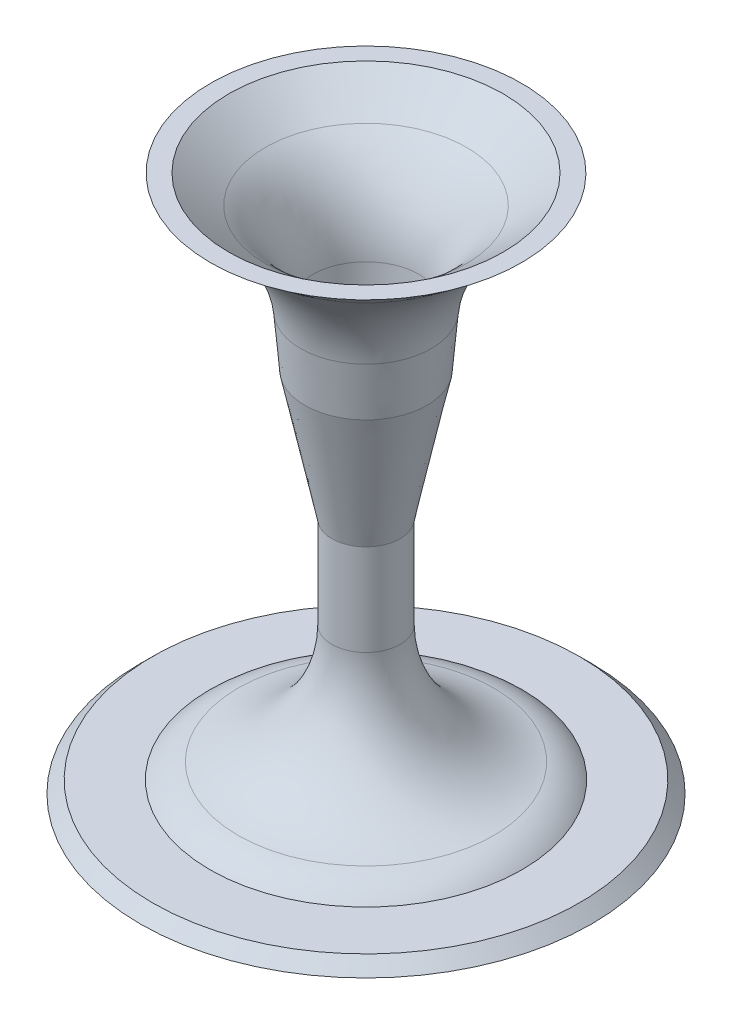
ISO-10303-21;
HEADER;
FILE_DESCRIPTION(('STEP AP214'),'2;1');
FILE_NAME('part.step','',(''),(''),'','','');
FILE_SCHEMA(('AUTOMOTIVE_DESIGN { 1 0 10303 214 1 1 1 1 }'));
ENDSEC;
DATA;
#1=APPLICATION_CONTEXT('core data for automotive mechanical design processes');
#2=APPLICATION_PROTOCOL_DEFINITION('international standard','automotive_design',2000,#1);
#3=PRODUCT_CONTEXT('',#1,'mechanical');
#4=PRODUCT('Part','Part','',(#3));
#5=PRODUCT_RELATED_PRODUCT_CATEGORY('part','',(#4));
#6=PRODUCT_DEFINITION_FORMATION('','',#4);
#7=PRODUCT_DEFINITION_CONTEXT('part definition',#1,'design');
#8=PRODUCT_DEFINITION('design','',#6,#7);
#9=PRODUCT_DEFINITION_SHAPE('','',#8);
#10=(LENGTH_UNIT() NAMED_UNIT(*) SI_UNIT(.MILLI.,.METRE.));
#11=(NAMED_UNIT(*) PLANE_ANGLE_UNIT() SI_UNIT($,.RADIAN.));
#12=(NAMED_UNIT(*) SI_UNIT($,.STERADIAN.) SOLID_ANGLE_UNIT());
#13=UNCERTAINTY_MEASURE_WITH_UNIT(LENGTH_MEASURE(1.E-05),#10,'distance_accuracy_value','');
#14=(GEOMETRIC_REPRESENTATION_CONTEXT(3) GLOBAL_UNCERTAINTY_ASSIGNED_CONTEXT((#13)) GLOBAL_UNIT_ASSIGNED_CONTEXT((#10,
#11,#12)) REPRESENTATION_CONTEXT('',''));
#15=CARTESIAN_POINT('',(0.,0.,0.));
#16=DIRECTION('',(0.,0.,1.));
#17=DIRECTION('',(1.,0.,0.));
#18=AXIS2_PLACEMENT_3D('',#15,#16,#17);
#19=CARTESIAN_POINT('',(-25.5899999999998,-58.1499999999998,0.));
#20=DIRECTION('',(0.,1.,0.));
#21=DIRECTION('',(0.,0.,1.));
#22=AXIS2_PLACEMENT_3D('',#19,#20,#21);
#23=PLANE('',#22);
#24=CARTESIAN_POINT('',(0.,-58.1499999999998,0.));
#25=DIRECTION('',(0.,1.,0.));
#26=DIRECTION('',(0.,0.,1.));
#27=AXIS2_PLACEMENT_3D('',#24,#25,#26);
#28=CIRCLE('',#27,35.);
#29=CARTESIAN_POINT('',(0.,-58.1499999999998,35.));
#30=VERTEX_POINT('',#29);
#31=EDGE_CURVE('E53',#30,#30,#28,.T.);
#32=ORIENTED_EDGE('',*,*,#31,.T.);
#33=EDGE_LOOP('',(#32));
#34=FACE_BOUND('',#33,.T.);
#35=CARTESIAN_POINT('',(0.,-58.1499999999998,0.));
#36=DIRECTION('',(0.,1.,0.));
#37=DIRECTION('',(0.,0.,1.));
#38=AXIS2_PLACEMENT_3D('',#35,#36,#37);
#39=CIRCLE('',#38,25.5899999999998);
#40=CARTESIAN_POINT('',(0.,-58.1499999999998,25.5899999999998));
#41=VERTEX_POINT('',#40);
#42=EDGE_CURVE('E85',#41,#41,#39,.T.);
#43=ORIENTED_EDGE('',*,*,#42,.F.);
#44=EDGE_LOOP('',(#43));
#45=FACE_BOUND('',#44,.T.);
#46=ADVANCED_FACE('F44',(#34,#45),#23,.T.);
#47=CARTESIAN_POINT('',(0.,-58.1499999999998,0.));
#48=DIRECTION('',(0.,-1.,0.));
#49=DIRECTION('',(0.,0.,-1.));
#50=AXIS2_PLACEMENT_3D('',#47,#48,#49);
#51=CONICAL_SURFACE('',#50,35.,0.78539816339745);
#52=CARTESIAN_POINT('',(0.,-60.1499999999998,0.));
#53=DIRECTION('',(0.,1.,0.));
#54=DIRECTION('',(0.,0.,1.));
#55=AXIS2_PLACEMENT_3D('',#52,#53,#54);
#56=CIRCLE('',#55,37.);
#57=CARTESIAN_POINT('',(0.,-60.1499999999998,37.));
#58=VERTEX_POINT('',#57);
#59=EDGE_CURVE('E143',#58,#58,#56,.T.);
#60=ORIENTED_EDGE('',*,*,#59,.T.);
#61=EDGE_LOOP('',(#60));
#62=FACE_BOUND('',#61,.T.);
#63=ORIENTED_EDGE('',*,*,#31,.F.);
#64=EDGE_LOOP('',(#63));
#65=FACE_BOUND('',#64,.T.);
#66=ADVANCED_FACE('F69',(#62,#65),#51,.T.);
#67=CARTESIAN_POINT('',(-37.,-60.1499999999998,0.));
#68=DIRECTION('',(0.,-1.,0.));
#69=DIRECTION('',(0.,0.,-1.));
#70=AXIS2_PLACEMENT_3D('',#67,#68,#69);
#71=PLANE('',#70);
#72=ORIENTED_EDGE('',*,*,#59,.F.);
#73=EDGE_LOOP('',(#72));
#74=FACE_BOUND('',#73,.T.);
#75=ADVANCED_FACE('F59',(#74),#71,.T.);
#76=CARTESIAN_POINT('',(0.,-58.1499999999998,0.));
#77=DIRECTION('',(0.,1.,0.));
#78=DIRECTION('',(0.,0.,1.));
#79=AXIS2_PLACEMENT_3D('',#76,#77,#78);
#80=CONICAL_SURFACE('',#79,0.,0.1617561098565);
#81=CARTESIAN_POINT('',(0.,-36.15,0.));
#82=DIRECTION('',(0.,1.,0.));
#83=DIRECTION('',(0.,0.,1.));
#84=AXIS2_PLACEMENT_3D('',#81,#82,#83);
#85=CIRCLE('',#84,3.58999999999998);
#86=CARTESIAN_POINT('',(0.,-36.15,3.58999999999998));
#87=VERTEX_POINT('',#86);
#88=EDGE_CURVE('E140',#87,#87,#85,.T.);
#89=ORIENTED_EDGE('',*,*,#88,.T.);
#90=EDGE_LOOP('',(#89));
#91=FACE_BOUND('',#90,.T.);
#92=CARTESIAN_POINT('',(0.,-58.1499999999998,0.));
#93=VERTEX_POINT('',#92);
#94=VERTEX_LOOP('',#93);
#95=FACE_BOUND('',#94,.T.);
#96=ADVANCED_FACE('F56',(#91,#95),#80,.F.);
#97=CARTESIAN_POINT('',(0.,74.3904688799529,0.));
#98=DIRECTION('',(0.,1.,0.));
#99=DIRECTION('',(0.,0.,1.));
#100=AXIS2_PLACEMENT_3D('',#97,#98,#99);
#101=CYLINDRICAL_SURFACE('',#100,3.58999999999998);
#102=CARTESIAN_POINT('',(0.,-21.15,0.));
#103=DIRECTION('',(0.,1.,0.));
#104=DIRECTION('',(0.,0.,1.));
#105=AXIS2_PLACEMENT_3D('',#102,#103,#104);
#106=CIRCLE('',#105,3.58999999999999);
#107=CARTESIAN_POINT('',(0.,-21.15,3.58999999999999));
#108=VERTEX_POINT('',#107);
#109=EDGE_CURVE('E136',#108,#108,#106,.T.);
#110=ORIENTED_EDGE('',*,*,#109,.T.);
#111=EDGE_LOOP('',(#110));
#112=FACE_BOUND('',#111,.T.);
#113=ORIENTED_EDGE('',*,*,#88,.F.);
#114=EDGE_LOOP('',(#113));
#115=FACE_BOUND('',#114,.T.);
#116=ADVANCED_FACE('F58',(#112,#115),#101,.F.);
#117=CARTESIAN_POINT('',(0.,-21.15,0.));
#118=DIRECTION('',(0.,1.,0.));
#119=DIRECTION('',(0.,0.,1.));
#120=AXIS2_PLACEMENT_3D('',#117,#118,#119);
#121=CONICAL_SURFACE('',#120,3.58999999999999,0.205565312722542);
#122=CARTESIAN_POINT('',(0.,0.,0.));
#123=DIRECTION('',(0.,1.,0.));
#124=DIRECTION('',(0.,0.,1.));
#125=AXIS2_PLACEMENT_3D('',#122,#123,#124);
#126=CIRCLE('',#125,8.);
#127=CARTESIAN_POINT('',(0.,0.,8.));
#128=VERTEX_POINT('',#127);
#129=EDGE_CURVE('E132',#128,#128,#126,.T.);
#130=ORIENTED_EDGE('',*,*,#129,.T.);
#131=EDGE_LOOP('',(#130));
#132=FACE_BOUND('',#131,.T.);
#133=ORIENTED_EDGE('',*,*,#109,.F.);
#134=EDGE_LOOP('',(#133));
#135=FACE_BOUND('',#134,.T.);
#136=ADVANCED_FACE('F66',(#132,#135),#121,.F.);
#137=CARTESIAN_POINT('',(0.,0.,0.));
#138=DIRECTION('',(0.,1.,0.));
#139=DIRECTION('',(0.,0.,1.));
#140=AXIS2_PLACEMENT_3D('',#137,#138,#139);
#141=CONICAL_SURFACE('',#140,8.,0.0831412318884395);
#142=CARTESIAN_POINT('',(0.,9.19533592387511,0.));
#143=DIRECTION('',(0.,1.,0.));
#144=DIRECTION('',(0.,0.,1.));
#145=AXIS2_PLACEMENT_3D('',#142,#143,#144);
#146=CIRCLE('',#145,8.76627799365624);
#147=CARTESIAN_POINT('',(0.,9.19533592387511,8.76627799365624));
#148=VERTEX_POINT('',#147);
#149=EDGE_CURVE('E128',#148,#148,#146,.T.);
#150=ORIENTED_EDGE('',*,*,#149,.T.);
#151=EDGE_LOOP('',(#150));
#152=FACE_BOUND('',#151,.T.);
#153=ORIENTED_EDGE('',*,*,#129,.F.);
#154=EDGE_LOOP('',(#153));
#155=FACE_BOUND('',#154,.T.);
#156=ADVANCED_FACE('F154',(#152,#155),#141,.F.);
#157=CARTESIAN_POINT('',(0.,7.53442632680031,0.));
#158=DIRECTION('',(0.,1.,0.));
#159=DIRECTION('',(0.,0.,1.));
#160=AXIS2_PLACEMENT_3D('',#157,#158,#159);
#161=TOROIDAL_SURFACE('',#160,28.6971931585538,20.);
#162=CARTESIAN_POINT('',(0.,23.3869061088923,0.));
#163=DIRECTION('',(0.,1.,0.));
#164=DIRECTION('',(0.,0.,1.));
#165=AXIS2_PLACEMENT_3D('',#162,#163,#164);
#166=CIRCLE('',#165,16.50297794156);
#167=CARTESIAN_POINT('',(0.,23.3869061088923,16.50297794156));
#168=VERTEX_POINT('',#167);
#169=EDGE_CURVE('E124',#168,#168,#166,.T.);
#170=ORIENTED_EDGE('',*,*,#169,.T.);
#171=EDGE_LOOP('',(#170));
#172=FACE_BOUND('',#171,.T.);
#173=ORIENTED_EDGE('',*,*,#149,.F.);
#174=EDGE_LOOP('',(#173));
#175=FACE_BOUND('',#174,.T.);
#176=ADVANCED_FACE('F160',(#172,#175),#161,.T.);
#177=CARTESIAN_POINT('',(0.,23.3869061088923,0.));
#178=DIRECTION('',(0.,1.,0.));
#179=DIRECTION('',(0.,0.,1.));
#180=AXIS2_PLACEMENT_3D('',#177,#178,#179);
#181=CONICAL_SURFACE('',#180,16.50297794156,0.915100700553362);
#182=CARTESIAN_POINT('',(0.,28.,0.));
#183=DIRECTION('',(0.,1.,0.));
#184=DIRECTION('',(0.,0.,1.));
#185=AXIS2_PLACEMENT_3D('',#182,#183,#184);
#186=CIRCLE('',#185,22.5);
#187=CARTESIAN_POINT('',(0.,28.,22.5));
#188=VERTEX_POINT('',#187);
#189=EDGE_CURVE('E120',#188,#188,#186,.T.);
#190=ORIENTED_EDGE('',*,*,#189,.T.);
#191=EDGE_LOOP('',(#190));
#192=FACE_BOUND('',#191,.T.);
#193=ORIENTED_EDGE('',*,*,#169,.F.);
#194=EDGE_LOOP('',(#193));
#195=FACE_BOUND('',#194,.T.);
#196=ADVANCED_FACE('F166',(#192,#195),#181,.F.);
#197=CARTESIAN_POINT('',(-25.5,28.,0.));
#198=DIRECTION('',(0.,1.,0.));
#199=DIRECTION('',(0.,0.,1.));
#200=AXIS2_PLACEMENT_3D('',#197,#198,#199);
#201=PLANE('',#200);
#202=CARTESIAN_POINT('',(0.,28.,0.));
#203=DIRECTION('',(0.,1.,0.));
#204=DIRECTION('',(0.,0.,1.));
#205=AXIS2_PLACEMENT_3D('',#202,#203,#204);
#206=CIRCLE('',#205,25.5);
#207=CARTESIAN_POINT('',(0.,28.,25.5));
#208=VERTEX_POINT('',#207);
#209=EDGE_CURVE('E116',#208,#208,#206,.T.);
#210=ORIENTED_EDGE('',*,*,#209,.T.);
#211=EDGE_LOOP('',(#210));
#212=FACE_BOUND('',#211,.T.);
#213=ORIENTED_EDGE('',*,*,#189,.F.);
#214=EDGE_LOOP('',(#213));
#215=FACE_BOUND('',#214,.T.);
#216=ADVANCED_FACE('F170',(#212,#215),#201,.T.);
#217=CARTESIAN_POINT('',(0.,28.,0.));
#218=DIRECTION('',(0.,1.,0.));
#219=DIRECTION('',(0.,0.,1.));
#220=AXIS2_PLACEMENT_3D('',#217,#218,#219);
#221=CONICAL_SURFACE('',#220,25.5,0.915425013533382);
#222=CARTESIAN_POINT('',(0.,22.5848665132846,0.));
#223=DIRECTION('',(0.,1.,0.));
#224=DIRECTION('',(0.,0.,1.));
#225=AXIS2_PLACEMENT_3D('',#222,#223,#224);
#226=CIRCLE('',#225,18.4556003016898);
#227=CARTESIAN_POINT('',(0.,22.5848665132846,18.4556003016898));
#228=VERTEX_POINT('',#227);
#229=EDGE_CURVE('E112',#228,#228,#226,.T.);
#230=ORIENTED_EDGE('',*,*,#229,.T.);
#231=EDGE_LOOP('',(#230));
#232=FACE_BOUND('',#231,.T.);
#233=ORIENTED_EDGE('',*,*,#209,.F.);
#234=EDGE_LOOP('',(#233));
#235=FACE_BOUND('',#234,.T.);
#236=ADVANCED_FACE('F174',(#232,#235),#221,.T.);
#237=CARTESIAN_POINT('',(0.,6.72843282265913,0.));
#238=DIRECTION('',(0.,1.,0.));
#239=DIRECTION('',(0.,0.,1.));
#240=AXIS2_PLACEMENT_3D('',#237,#238,#239);
#241=TOROIDAL_SURFACE('',#240,30.6446737125278,20.);
#242=CARTESIAN_POINT('',(0.,8.41500164403586,0.));
#243=DIRECTION('',(0.,1.,0.));
#244=DIRECTION('',(0.,0.,1.));
#245=AXIS2_PLACEMENT_3D('',#242,#243,#244);
#246=CIRCLE('',#245,10.7159134497628);
#247=CARTESIAN_POINT('',(0.,8.41500164403586,10.7159134497628));
#248=VERTEX_POINT('',#247);
#249=EDGE_CURVE('E108',#248,#248,#246,.T.);
#250=ORIENTED_EDGE('',*,*,#249,.T.);
#251=EDGE_LOOP('',(#250));
#252=FACE_BOUND('',#251,.T.);
#253=ORIENTED_EDGE('',*,*,#229,.F.);
#254=EDGE_LOOP('',(#253));
#255=FACE_BOUND('',#254,.T.);
#256=ADVANCED_FACE('F178',(#252,#255),#241,.F.);
#257=CARTESIAN_POINT('',(0.,8.41500164403586,0.));
#258=DIRECTION('',(0.,1.,0.));
#259=DIRECTION('',(0.,0.,1.));
#260=AXIS2_PLACEMENT_3D('',#257,#258,#259);
#261=CONICAL_SURFACE('',#260,10.7159134497628,0.0844287095451079);
#262=CARTESIAN_POINT('',(0.,0.,0.));
#263=DIRECTION('',(0.,1.,0.));
#264=DIRECTION('',(0.,0.,1.));
#265=AXIS2_PLACEMENT_3D('',#262,#263,#264);
#266=CIRCLE('',#265,10.0037527725539);
#267=CARTESIAN_POINT('',(0.,0.,10.0037527725539));
#268=VERTEX_POINT('',#267);
#269=EDGE_CURVE('E104',#268,#268,#266,.T.);
#270=ORIENTED_EDGE('',*,*,#269,.T.);
#271=EDGE_LOOP('',(#270));
#272=FACE_BOUND('',#271,.T.);
#273=ORIENTED_EDGE('',*,*,#249,.F.);
#274=EDGE_LOOP('',(#273));
#275=FACE_BOUND('',#274,.T.);
#276=ADVANCED_FACE('F182',(#272,#275),#261,.T.);
#277=CARTESIAN_POINT('',(0.,0.,0.));
#278=DIRECTION('',(0.,1.,0.));
#279=DIRECTION('',(0.,0.,1.));
#280=AXIS2_PLACEMENT_3D('',#277,#278,#279);
#281=CONICAL_SURFACE('',#280,10.0037527725539,0.205735349834316);
#282=CARTESIAN_POINT('',(0.,-21.15,0.));
#283=DIRECTION('',(0.,1.,0.));
#284=DIRECTION('',(0.,0.,1.));
#285=AXIS2_PLACEMENT_3D('',#282,#283,#284);
#286=CIRCLE('',#285,5.58999999999984);
#287=CARTESIAN_POINT('',(0.,-21.15,5.58999999999984));
#288=VERTEX_POINT('',#287);
#289=EDGE_CURVE('E94',#288,#288,#286,.T.);
#290=ORIENTED_EDGE('',*,*,#289,.T.);
#291=EDGE_LOOP('',(#290));
#292=FACE_BOUND('',#291,.T.);
#293=ORIENTED_EDGE('',*,*,#269,.F.);
#294=EDGE_LOOP('',(#293));
#295=FACE_BOUND('',#294,.T.);
#296=ADVANCED_FACE('F186',(#292,#295),#281,.T.);
#297=CARTESIAN_POINT('',(0.,74.3904688799529,0.));
#298=DIRECTION('',(0.,1.,0.));
#299=DIRECTION('',(0.,0.,1.));
#300=AXIS2_PLACEMENT_3D('',#297,#298,#299);
#301=CYLINDRICAL_SURFACE('',#300,5.58999999999983);
#302=CARTESIAN_POINT('',(0.,-36.15,0.));
#303=DIRECTION('',(0.,1.,0.));
#304=DIRECTION('',(0.,0.,1.));
#305=AXIS2_PLACEMENT_3D('',#302,#303,#304);
#306=CIRCLE('',#305,5.58999999999983);
#307=CARTESIAN_POINT('',(0.,-36.15,5.58999999999983));
#308=VERTEX_POINT('',#307);
#309=EDGE_CURVE('E88',#308,#308,#306,.T.);
#310=ORIENTED_EDGE('',*,*,#309,.T.);
#311=EDGE_LOOP('',(#310));
#312=FACE_BOUND('',#311,.T.);
#313=ORIENTED_EDGE('',*,*,#289,.F.);
#314=EDGE_LOOP('',(#313));
#315=FACE_BOUND('',#314,.T.);
#316=ADVANCED_FACE('F190',(#312,#315),#301,.T.);
#317=CARTESIAN_POINT('',(0.,-36.15,0.));
#318=DIRECTION('',(0.,1.,0.));
#319=DIRECTION('',(0.,0.,1.));
#320=AXIS2_PLACEMENT_3D('',#317,#318,#319);
#321=TOROIDAL_SURFACE('',#320,25.5899999999998,20.);
#322=CARTESIAN_POINT('',(0.,-55.6045454545454,0.));
#323=DIRECTION('',(0.,1.,0.));
#324=DIRECTION('',(-1.,0.,0.));
#325=AXIS2_PLACEMENT_3D('',#322,#323,#324);
#326=CIRCLE('',#325,20.9509633373917);
#327=CARTESIAN_POINT('',(-20.9509633373917,-55.6045454545454,0.));
#328=VERTEX_POINT('',#327);
#329=EDGE_CURVE('E11',#328,#328,#326,.T.);
#330=ORIENTED_EDGE('',*,*,#329,.T.);
#331=EDGE_LOOP('',(#330));
#332=FACE_BOUND('',#331,.T.);
#333=ORIENTED_EDGE('',*,*,#309,.F.);
#334=EDGE_LOOP('',(#333));
#335=FACE_BOUND('',#334,.T.);
#336=ADVANCED_FACE('F194',(#332,#335),#321,.F.);
#337=CARTESIAN_POINT('',(0.,-65.3318181818182,0.));
#338=DIRECTION('',(0.,1.,0.));
#339=DIRECTION('',(-1.,0.,0.));
#340=AXIS2_PLACEMENT_3D('',#337,#338,#339);
#341=TOROIDAL_SURFACE('',#340,18.6314450060875,10.);
#342=ORIENTED_EDGE('',*,*,#42,.T.);
#343=EDGE_LOOP('',(#342));
#344=FACE_BOUND('',#343,.T.);
#345=ORIENTED_EDGE('',*,*,#329,.F.);
#346=EDGE_LOOP('',(#345));
#347=FACE_BOUND('',#346,.T.);
#348=ADVANCED_FACE('F46',(#344,#347),#341,.T.);
#349=CLOSED_SHELL('',(#46,#66,#75,#96,#116,#136,#156,#176,#196,#216,#236,#256,#276,#296,#316,
#336,#348));
#350=CARTESIAN_POINT('',(0.,-36.15,0.));
#351=DIRECTION('',(0.,1.,0.));
#352=DIRECTION('',(0.,0.,1.));
#353=AXIS2_PLACEMENT_3D('',#350,#351,#352);
#354=TOROIDAL_SURFACE('',#353,25.5899999999998,21.9999999999999);
#355=CARTESIAN_POINT('',(0.,-56.1499999999998,0.));
#356=DIRECTION('',(0.,1.,0.));
#357=DIRECTION('',(0.,0.,1.));
#358=AXIS2_PLACEMENT_3D('',#355,#356,#357);
#359=CIRCLE('',#358,16.424848610088);
#360=CARTESIAN_POINT('',(0.,-56.1499999999998,16.424848610088));
#361=VERTEX_POINT('',#360);
#362=EDGE_CURVE('E223',#361,#361,#359,.T.);
#363=ORIENTED_EDGE('',*,*,#362,.F.);
#364=EDGE_LOOP('',(#363));
#365=FACE_BOUND('',#364,.T.);
#366=CARTESIAN_POINT('',(0.,-42.6152649309004,0.));
#367=DIRECTION('',(0.,1.,0.));
#368=DIRECTION('',(0.,0.,1.));
#369=AXIS2_PLACEMENT_3D('',#366,#367,#368);
#370=CIRCLE('',#369,4.56143967426038);
#371=CARTESIAN_POINT('',(0.,-42.6152649309004,4.56143967426038));
#372=VERTEX_POINT('',#371);
#373=EDGE_CURVE('E89',#372,#372,#370,.T.);
#374=ORIENTED_EDGE('',*,*,#373,.T.);
#375=EDGE_LOOP('',(#374));
#376=FACE_BOUND('',#375,.T.);
#377=ADVANCED_FACE('F199',(#365,#376),#354,.T.);
#378=CARTESIAN_POINT('',(0.,-58.1499999999998,0.));
#379=DIRECTION('',(0.,1.,0.));
#380=DIRECTION('',(0.,0.,1.));
#381=AXIS2_PLACEMENT_3D('',#378,#379,#380);
#382=CONICAL_SURFACE('',#381,2.02645336071186,0.161756109856501);
#383=ORIENTED_EDGE('',*,*,#373,.F.);
#384=EDGE_LOOP('',(#383));
#385=FACE_BOUND('',#384,.T.);
#386=CARTESIAN_POINT('',(0.,-58.1499999999998,0.));
#387=DIRECTION('',(0.,1.,0.));
#388=DIRECTION('',(0.,0.,1.));
#389=AXIS2_PLACEMENT_3D('',#386,#387,#388);
#390=CIRCLE('',#389,2.02645336071186);
#391=CARTESIAN_POINT('',(0.,-58.1499999999998,2.02645336071186));
#392=VERTEX_POINT('',#391);
#393=EDGE_CURVE('E97',#392,#392,#390,.T.);
#394=ORIENTED_EDGE('',*,*,#393,.T.);
#395=EDGE_LOOP('',(#394));
#396=FACE_BOUND('',#395,.T.);
#397=ADVANCED_FACE('F202',(#385,#396),#382,.T.);
#398=CARTESIAN_POINT('',(-2.02645336071187,-58.1499999999998,0.));
#399=DIRECTION('',(0.,-1.,0.));
#400=DIRECTION('',(0.,0.,-1.));
#401=AXIS2_PLACEMENT_3D('',#398,#399,#400);
#402=PLANE('',#401);
#403=ORIENTED_EDGE('',*,*,#393,.F.);
#404=EDGE_LOOP('',(#403));
#405=FACE_BOUND('',#404,.T.);
#406=CARTESIAN_POINT('',(0.,-58.1499999999998,0.));
#407=DIRECTION('',(0.,1.,0.));
#408=DIRECTION('',(0.,0.,1.));
#409=AXIS2_PLACEMENT_3D('',#406,#407,#408);
#410=CIRCLE('',#409,16.424848610088);
#411=CARTESIAN_POINT('',(0.,-58.1499999999998,16.424848610088));
#412=VERTEX_POINT('',#411);
#413=EDGE_CURVE('E220',#412,#412,#410,.T.);
#414=ORIENTED_EDGE('',*,*,#413,.T.);
#415=EDGE_LOOP('',(#414));
#416=FACE_BOUND('',#415,.T.);
#417=ADVANCED_FACE('F207',(#405,#416),#402,.F.);
#418=CARTESIAN_POINT('',(0.,74.3904688799529,0.));
#419=DIRECTION('',(0.,1.,0.));
#420=DIRECTION('',(0.,0.,1.));
#421=AXIS2_PLACEMENT_3D('',#418,#419,#420);
#422=CYLINDRICAL_SURFACE('',#421,16.424848610088);
#423=ORIENTED_EDGE('',*,*,#413,.F.);
#424=EDGE_LOOP('',(#423));
#425=FACE_BOUND('',#424,.T.);
#426=ORIENTED_EDGE('',*,*,#362,.T.);
#427=EDGE_LOOP('',(#426));
#428=FACE_BOUND('',#427,.T.);
#429=ADVANCED_FACE('F211',(#425,#428),#422,.F.);
#430=CLOSED_SHELL('',(#377,#397,#417,#429));
#431=ORIENTED_CLOSED_SHELL('',*,#430,.T.);
#432=BREP_WITH_VOIDS('B2',#349,(#431));
#433=ADVANCED_BREP_SHAPE_REPRESENTATION('',(#18,#432),#14);
#434=SHAPE_DEFINITION_REPRESENTATION(#9,#433);
ENDSEC;
END-ISO-10303-21;
